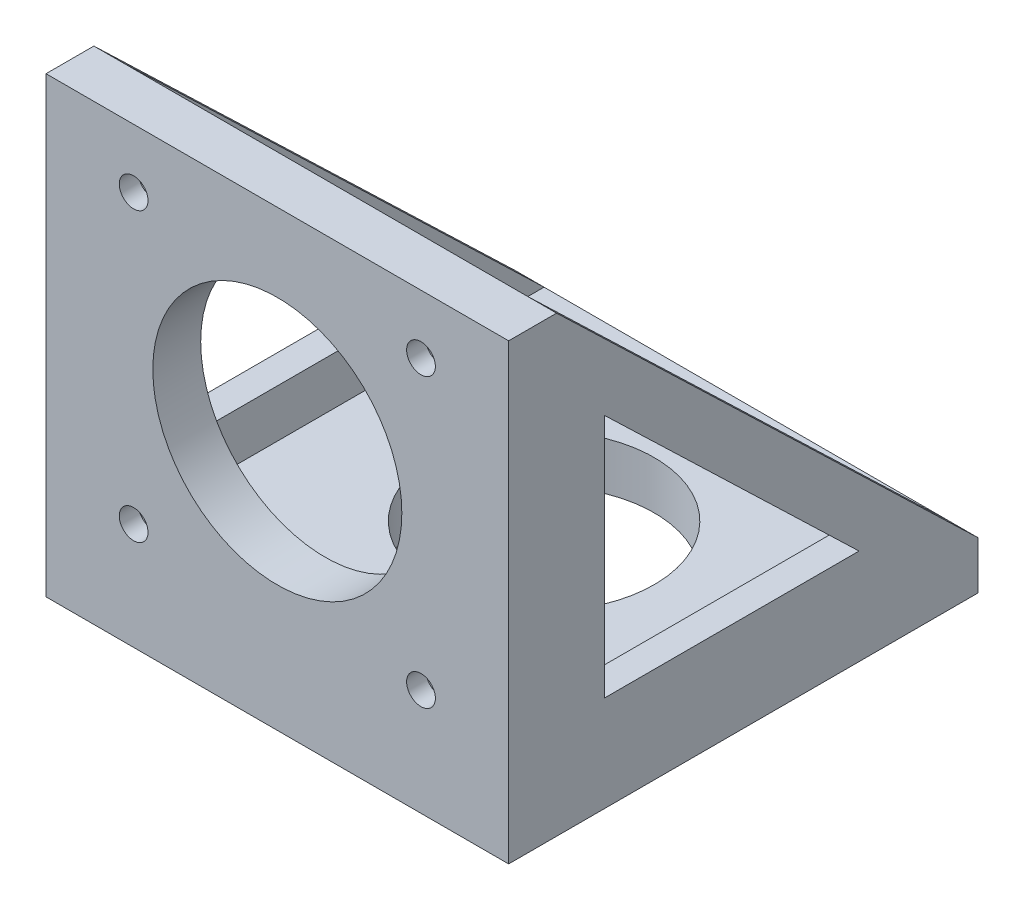
ISO-10303-21;
HEADER;
FILE_DESCRIPTION(('STEP AP214'),'2;1');
FILE_NAME('part.step','',(''),(''),'','','');
FILE_SCHEMA(('AUTOMOTIVE_DESIGN { 1 0 10303 214 1 1 1 1 }'));
ENDSEC;
DATA;
#1=APPLICATION_CONTEXT('core data for automotive mechanical design processes');
#2=APPLICATION_PROTOCOL_DEFINITION('international standard','automotive_design',2000,#1);
#3=PRODUCT_CONTEXT('',#1,'mechanical');
#4=PRODUCT('Part','Part','',(#3));
#5=PRODUCT_RELATED_PRODUCT_CATEGORY('part','',(#4));
#6=PRODUCT_DEFINITION_FORMATION('','',#4);
#7=PRODUCT_DEFINITION_CONTEXT('part definition',#1,'design');
#8=PRODUCT_DEFINITION('design','',#6,#7);
#9=PRODUCT_DEFINITION_SHAPE('','',#8);
#10=(LENGTH_UNIT() NAMED_UNIT(*) SI_UNIT(.MILLI.,.METRE.));
#11=(NAMED_UNIT(*) PLANE_ANGLE_UNIT() SI_UNIT($,.RADIAN.));
#12=(NAMED_UNIT(*) SI_UNIT($,.STERADIAN.) SOLID_ANGLE_UNIT());
#13=UNCERTAINTY_MEASURE_WITH_UNIT(LENGTH_MEASURE(1.E-05),#10,'distance_accuracy_value','');
#14=(GEOMETRIC_REPRESENTATION_CONTEXT(3) GLOBAL_UNCERTAINTY_ASSIGNED_CONTEXT((#13)) GLOBAL_UNIT_ASSIGNED_CONTEXT((#10,
#11,#12)) REPRESENTATION_CONTEXT('',''));
#15=CARTESIAN_POINT('',(0.,0.,0.));
#16=DIRECTION('',(0.,0.,1.));
#17=DIRECTION('',(1.,0.,0.));
#18=AXIS2_PLACEMENT_3D('',#15,#16,#17);
#19=CARTESIAN_POINT('',(15.,41.15,24.5));
#20=DIRECTION('',(0.,0.,-1.));
#21=DIRECTION('',(-1.,0.,0.));
#22=AXIS2_PLACEMENT_3D('',#19,#20,#21);
#23=CYLINDRICAL_SURFACE('',#22,1.5);
#24=CARTESIAN_POINT('',(15.,41.15,24.5));
#25=DIRECTION('',(0.,0.,-1.));
#26=DIRECTION('',(-1.,0.,0.));
#27=AXIS2_PLACEMENT_3D('',#24,#25,#26);
#28=CIRCLE('',#27,1.5);
#29=CARTESIAN_POINT('',(13.5,41.15,24.5));
#30=VERTEX_POINT('',#29);
#31=EDGE_CURVE('E267',#30,#30,#28,.T.);
#32=ORIENTED_EDGE('',*,*,#31,.F.);
#33=EDGE_LOOP('',(#32));
#34=FACE_BOUND('',#33,.T.);
#35=CARTESIAN_POINT('',(15.,41.15,22.5));
#36=DIRECTION('',(0.,0.,-1.));
#37=DIRECTION('',(-1.,0.,0.));
#38=AXIS2_PLACEMENT_3D('',#35,#36,#37);
#39=CIRCLE('',#38,1.5);
#40=CARTESIAN_POINT('',(13.5,41.15,22.5));
#41=VERTEX_POINT('',#40);
#42=EDGE_CURVE('E39',#41,#41,#39,.F.);
#43=ORIENTED_EDGE('',*,*,#42,.F.);
#44=EDGE_LOOP('',(#43));
#45=FACE_BOUND('',#44,.T.);
#46=ADVANCED_FACE('F35',(#34,#45),#23,.F.);
#47=CARTESIAN_POINT('',(-15.,11.15,24.5));
#48=DIRECTION('',(0.,0.,-1.));
#49=DIRECTION('',(-1.,0.,0.));
#50=AXIS2_PLACEMENT_3D('',#47,#48,#49);
#51=CYLINDRICAL_SURFACE('',#50,1.5);
#52=CARTESIAN_POINT('',(-15.,11.15,24.5));
#53=DIRECTION('',(0.,0.,-1.));
#54=DIRECTION('',(1.,0.,0.));
#55=AXIS2_PLACEMENT_3D('',#52,#53,#54);
#56=CIRCLE('',#55,1.5);
#57=CARTESIAN_POINT('',(-13.5,11.15,24.5));
#58=VERTEX_POINT('',#57);
#59=EDGE_CURVE('E255',#58,#58,#56,.T.);
#60=ORIENTED_EDGE('',*,*,#59,.F.);
#61=EDGE_LOOP('',(#60));
#62=FACE_BOUND('',#61,.T.);
#63=CARTESIAN_POINT('',(-15.,11.15,22.5));
#64=DIRECTION('',(0.,0.,-1.));
#65=DIRECTION('',(-1.,0.,0.));
#66=AXIS2_PLACEMENT_3D('',#63,#64,#65);
#67=CIRCLE('',#66,1.5);
#68=CARTESIAN_POINT('',(-16.5,11.15,22.5));
#69=VERTEX_POINT('',#68);
#70=EDGE_CURVE('E328',#69,#69,#67,.F.);
#71=ORIENTED_EDGE('',*,*,#70,.F.);
#72=EDGE_LOOP('',(#71));
#73=FACE_BOUND('',#72,.T.);
#74=ADVANCED_FACE('F338',(#62,#73),#51,.F.);
#75=CARTESIAN_POINT('',(15.,11.15,24.5));
#76=DIRECTION('',(0.,0.,-1.));
#77=DIRECTION('',(-1.,0.,0.));
#78=AXIS2_PLACEMENT_3D('',#75,#76,#77);
#79=CYLINDRICAL_SURFACE('',#78,1.5);
#80=CARTESIAN_POINT('',(15.,11.15,24.5));
#81=DIRECTION('',(0.,0.,-1.));
#82=DIRECTION('',(1.,0.,0.));
#83=AXIS2_PLACEMENT_3D('',#80,#81,#82);
#84=CIRCLE('',#83,1.5);
#85=CARTESIAN_POINT('',(16.5,11.15,24.5));
#86=VERTEX_POINT('',#85);
#87=EDGE_CURVE('E258',#86,#86,#84,.T.);
#88=ORIENTED_EDGE('',*,*,#87,.F.);
#89=EDGE_LOOP('',(#88));
#90=FACE_BOUND('',#89,.T.);
#91=CARTESIAN_POINT('',(15.,11.15,22.5));
#92=DIRECTION('',(0.,0.,-1.));
#93=DIRECTION('',(-1.,0.,0.));
#94=AXIS2_PLACEMENT_3D('',#91,#92,#93);
#95=CIRCLE('',#94,1.5);
#96=CARTESIAN_POINT('',(13.5,11.15,22.5));
#97=VERTEX_POINT('',#96);
#98=EDGE_CURVE('E326',#97,#97,#95,.F.);
#99=ORIENTED_EDGE('',*,*,#98,.F.);
#100=EDGE_LOOP('',(#99));
#101=FACE_BOUND('',#100,.T.);
#102=ADVANCED_FACE('F344',(#90,#101),#79,.F.);
#103=CARTESIAN_POINT('',(-15.,41.15,24.5));
#104=DIRECTION('',(0.,0.,-1.));
#105=DIRECTION('',(-1.,0.,0.));
#106=AXIS2_PLACEMENT_3D('',#103,#104,#105);
#107=CYLINDRICAL_SURFACE('',#106,1.5);
#108=CARTESIAN_POINT('',(-15.,41.15,24.5));
#109=DIRECTION('',(0.,0.,-1.));
#110=DIRECTION('',(-1.,0.,0.));
#111=AXIS2_PLACEMENT_3D('',#108,#109,#110);
#112=CIRCLE('',#111,1.5);
#113=CARTESIAN_POINT('',(-16.5,41.15,24.5));
#114=VERTEX_POINT('',#113);
#115=EDGE_CURVE('E264',#114,#114,#112,.T.);
#116=ORIENTED_EDGE('',*,*,#115,.F.);
#117=EDGE_LOOP('',(#116));
#118=FACE_BOUND('',#117,.T.);
#119=CARTESIAN_POINT('',(-15.,41.15,22.5));
#120=DIRECTION('',(0.,0.,-1.));
#121=DIRECTION('',(-1.,0.,0.));
#122=AXIS2_PLACEMENT_3D('',#119,#120,#121);
#123=CIRCLE('',#122,1.5);
#124=CARTESIAN_POINT('',(-16.5,41.15,22.5));
#125=VERTEX_POINT('',#124);
#126=EDGE_CURVE('E207',#125,#125,#123,.F.);
#127=ORIENTED_EDGE('',*,*,#126,.F.);
#128=EDGE_LOOP('',(#127));
#129=FACE_BOUND('',#128,.T.);
#130=ADVANCED_FACE('F385',(#118,#129),#107,.F.);
#131=CARTESIAN_POINT('',(0.,5.,0.));
#132=DIRECTION('',(0.,1.,0.));
#133=DIRECTION('',(0.,0.,1.));
#134=AXIS2_PLACEMENT_3D('',#131,#132,#133);
#135=PLANE('',#134);
#136=DIRECTION('',(-1.,0.,0.));
#137=VECTOR('',#136,1.);
#138=CARTESIAN_POINT('',(-21.15,5.,19.5));
#139=LINE('',#138,#137);
#140=CARTESIAN_POINT('',(21.15,5.,19.5));
#141=VERTEX_POINT('',#140);
#142=CARTESIAN_POINT('',(-21.15,5.,19.5));
#143=VERTEX_POINT('',#142);
#144=EDGE_CURVE('E272',#141,#143,#139,.T.);
#145=ORIENTED_EDGE('',*,*,#144,.F.);
#146=DIRECTION('',(0.,0.,-1.));
#147=VECTOR('',#146,1.);
#148=CARTESIAN_POINT('',(21.15,5.,-24.5));
#149=LINE('',#148,#147);
#150=CARTESIAN_POINT('',(21.15,5.,-24.5));
#151=VERTEX_POINT('',#150);
#152=EDGE_CURVE('E316',#141,#151,#149,.T.);
#153=ORIENTED_EDGE('',*,*,#152,.T.);
#154=DIRECTION('',(-1.,0.,0.));
#155=VECTOR('',#154,1.);
#156=CARTESIAN_POINT('',(-21.15,5.,-24.5));
#157=LINE('',#156,#155);
#158=CARTESIAN_POINT('',(-21.15,5.,-24.5));
#159=VERTEX_POINT('',#158);
#160=EDGE_CURVE('E44',#151,#159,#157,.T.);
#161=ORIENTED_EDGE('',*,*,#160,.T.);
#162=DIRECTION('',(0.,0.,1.));
#163=VECTOR('',#162,1.);
#164=CARTESIAN_POINT('',(-21.15,5.,-24.5));
#165=LINE('',#164,#163);
#166=EDGE_CURVE('E11',#159,#143,#165,.T.);
#167=ORIENTED_EDGE('',*,*,#166,.T.);
#168=EDGE_LOOP('',(#145,#153,#161,#167));
#169=FACE_BOUND('',#168,.T.);
#170=CARTESIAN_POINT('',(15.5,5.,12.15));
#171=DIRECTION('',(0.,1.,0.));
#172=DIRECTION('',(0.,0.,-1.));
#173=AXIS2_PLACEMENT_3D('',#170,#171,#172);
#174=CIRCLE('',#173,1.49999999999999);
#175=CARTESIAN_POINT('',(15.5,5.,10.65));
#176=VERTEX_POINT('',#175);
#177=EDGE_CURVE('E292',#176,#176,#174,.T.);
#178=ORIENTED_EDGE('',*,*,#177,.F.);
#179=EDGE_LOOP('',(#178));
#180=FACE_BOUND('',#179,.T.);
#181=CARTESIAN_POINT('',(15.5,5.,-18.85));
#182=DIRECTION('',(0.,1.,0.));
#183=DIRECTION('',(0.,0.,1.));
#184=AXIS2_PLACEMENT_3D('',#181,#182,#183);
#185=CIRCLE('',#184,1.5);
#186=CARTESIAN_POINT('',(15.5,5.,-17.35));
#187=VERTEX_POINT('',#186);
#188=EDGE_CURVE('E304',#187,#187,#185,.T.);
#189=ORIENTED_EDGE('',*,*,#188,.F.);
#190=EDGE_LOOP('',(#189));
#191=FACE_BOUND('',#190,.T.);
#192=CARTESIAN_POINT('',(-15.5,5.,-18.85));
#193=DIRECTION('',(0.,1.,0.));
#194=DIRECTION('',(0.,0.,1.));
#195=AXIS2_PLACEMENT_3D('',#192,#193,#194);
#196=CIRCLE('',#195,1.5);
#197=CARTESIAN_POINT('',(-15.5,5.,-17.35));
#198=VERTEX_POINT('',#197);
#199=EDGE_CURVE('E310',#198,#198,#196,.T.);
#200=ORIENTED_EDGE('',*,*,#199,.F.);
#201=EDGE_LOOP('',(#200));
#202=FACE_BOUND('',#201,.T.);
#203=CARTESIAN_POINT('',(-15.5,5.,12.15));
#204=DIRECTION('',(0.,1.,0.));
#205=DIRECTION('',(0.,0.,-1.));
#206=AXIS2_PLACEMENT_3D('',#203,#204,#205);
#207=CIRCLE('',#206,1.5);
#208=CARTESIAN_POINT('',(-15.5,5.,10.65));
#209=VERTEX_POINT('',#208);
#210=EDGE_CURVE('E298',#209,#209,#207,.T.);
#211=ORIENTED_EDGE('',*,*,#210,.F.);
#212=EDGE_LOOP('',(#211));
#213=FACE_BOUND('',#212,.T.);
#214=CARTESIAN_POINT('',(0.,5.,-3.35));
#215=DIRECTION('',(0.,1.,0.));
#216=DIRECTION('',(0.,0.,1.));
#217=AXIS2_PLACEMENT_3D('',#214,#215,#216);
#218=CIRCLE('',#217,11.5);
#219=CARTESIAN_POINT('',(0.,5.,8.15));
#220=VERTEX_POINT('',#219);
#221=EDGE_CURVE('E286',#220,#220,#218,.T.);
#222=ORIENTED_EDGE('',*,*,#221,.F.);
#223=EDGE_LOOP('',(#222));
#224=FACE_BOUND('',#223,.T.);
#225=ADVANCED_FACE('F381',(#169,#180,#191,#202,#213,#224),#135,.T.);
#226=CARTESIAN_POINT('',(0.,0.,0.));
#227=DIRECTION('',(0.,1.,0.));
#228=DIRECTION('',(0.,0.,1.));
#229=AXIS2_PLACEMENT_3D('',#226,#227,#228);
#230=PLANE('',#229);
#231=DIRECTION('',(-1.,0.,0.));
#232=VECTOR('',#231,1.);
#233=CARTESIAN_POINT('',(-21.15,0.,-24.5));
#234=LINE('',#233,#232);
#235=CARTESIAN_POINT('',(24.15,0.,-24.5));
#236=VERTEX_POINT('',#235);
#237=CARTESIAN_POINT('',(-24.15,0.,-24.5));
#238=VERTEX_POINT('',#237);
#239=EDGE_CURVE('E313',#236,#238,#234,.T.);
#240=ORIENTED_EDGE('',*,*,#239,.F.);
#241=DIRECTION('',(0.,0.,-1.));
#242=VECTOR('',#241,1.);
#243=CARTESIAN_POINT('',(24.15,0.,-24.5));
#244=LINE('',#243,#242);
#245=CARTESIAN_POINT('',(24.15,0.,24.5));
#246=VERTEX_POINT('',#245);
#247=EDGE_CURVE('E240',#246,#236,#244,.T.);
#248=ORIENTED_EDGE('',*,*,#247,.F.);
#249=DIRECTION('',(1.,0.,0.));
#250=VECTOR('',#249,1.);
#251=CARTESIAN_POINT('',(-21.15,0.,24.5));
#252=LINE('',#251,#250);
#253=CARTESIAN_POINT('',(-24.15,0.,24.5));
#254=VERTEX_POINT('',#253);
#255=EDGE_CURVE('E319',#254,#246,#252,.T.);
#256=ORIENTED_EDGE('',*,*,#255,.F.);
#257=DIRECTION('',(0.,0.,1.));
#258=VECTOR('',#257,1.);
#259=CARTESIAN_POINT('',(-24.15,0.,-24.5));
#260=LINE('',#259,#258);
#261=EDGE_CURVE('E219',#238,#254,#260,.T.);
#262=ORIENTED_EDGE('',*,*,#261,.F.);
#263=EDGE_LOOP('',(#240,#248,#256,#262));
#264=FACE_BOUND('',#263,.T.);
#265=CARTESIAN_POINT('',(-15.5,0.,-18.85));
#266=DIRECTION('',(0.,1.,0.));
#267=DIRECTION('',(0.,0.,1.));
#268=AXIS2_PLACEMENT_3D('',#265,#266,#267);
#269=CIRCLE('',#268,1.5);
#270=CARTESIAN_POINT('',(-15.5,0.,-17.35));
#271=VERTEX_POINT('',#270);
#272=EDGE_CURVE('E307',#271,#271,#269,.T.);
#273=ORIENTED_EDGE('',*,*,#272,.T.);
#274=EDGE_LOOP('',(#273));
#275=FACE_BOUND('',#274,.T.);
#276=CARTESIAN_POINT('',(15.5,0.,-18.85));
#277=DIRECTION('',(0.,1.,0.));
#278=DIRECTION('',(0.,0.,1.));
#279=AXIS2_PLACEMENT_3D('',#276,#277,#278);
#280=CIRCLE('',#279,1.5);
#281=CARTESIAN_POINT('',(15.5,0.,-17.35));
#282=VERTEX_POINT('',#281);
#283=EDGE_CURVE('E301',#282,#282,#280,.T.);
#284=ORIENTED_EDGE('',*,*,#283,.T.);
#285=EDGE_LOOP('',(#284));
#286=FACE_BOUND('',#285,.T.);
#287=CARTESIAN_POINT('',(-15.5,0.,12.15));
#288=DIRECTION('',(0.,1.,0.));
#289=DIRECTION('',(0.,0.,-1.));
#290=AXIS2_PLACEMENT_3D('',#287,#288,#289);
#291=CIRCLE('',#290,1.5);
#292=CARTESIAN_POINT('',(-15.5,0.,10.65));
#293=VERTEX_POINT('',#292);
#294=EDGE_CURVE('E295',#293,#293,#291,.T.);
#295=ORIENTED_EDGE('',*,*,#294,.T.);
#296=EDGE_LOOP('',(#295));
#297=FACE_BOUND('',#296,.T.);
#298=CARTESIAN_POINT('',(15.5,0.,12.15));
#299=DIRECTION('',(0.,1.,0.));
#300=DIRECTION('',(0.,0.,-1.));
#301=AXIS2_PLACEMENT_3D('',#298,#299,#300);
#302=CIRCLE('',#301,1.49999999999999);
#303=CARTESIAN_POINT('',(15.5,0.,10.65));
#304=VERTEX_POINT('',#303);
#305=EDGE_CURVE('E289',#304,#304,#302,.T.);
#306=ORIENTED_EDGE('',*,*,#305,.T.);
#307=EDGE_LOOP('',(#306));
#308=FACE_BOUND('',#307,.T.);
#309=CARTESIAN_POINT('',(0.,0.,-3.35));
#310=DIRECTION('',(0.,1.,0.));
#311=DIRECTION('',(0.,0.,1.));
#312=AXIS2_PLACEMENT_3D('',#309,#310,#311);
#313=CIRCLE('',#312,11.5);
#314=CARTESIAN_POINT('',(0.,0.,8.15));
#315=VERTEX_POINT('',#314);
#316=EDGE_CURVE('E285',#315,#315,#313,.T.);
#317=ORIENTED_EDGE('',*,*,#316,.T.);
#318=EDGE_LOOP('',(#317));
#319=FACE_BOUND('',#318,.T.);
#320=ADVANCED_FACE('F384',(#264,#275,#286,#297,#308,#319),#230,.F.);
#321=CARTESIAN_POINT('',(-21.15,5.,-24.5));
#322=DIRECTION('',(0.,0.,1.));
#323=DIRECTION('',(1.,0.,0.));
#324=AXIS2_PLACEMENT_3D('',#321,#322,#323);
#325=PLANE('',#324);
#326=ORIENTED_EDGE('',*,*,#239,.T.);
#327=DIRECTION('',(0.,-1.,0.));
#328=VECTOR('',#327,1.);
#329=CARTESIAN_POINT('',(-24.15,5.,-24.5));
#330=LINE('',#329,#328);
#331=CARTESIAN_POINT('',(-24.15,5.,-24.5));
#332=VERTEX_POINT('',#331);
#333=EDGE_CURVE('E216',#332,#238,#330,.T.);
#334=ORIENTED_EDGE('',*,*,#333,.F.);
#335=DIRECTION('',(1.,0.,0.));
#336=VECTOR('',#335,1.);
#337=CARTESIAN_POINT('',(-24.15,5.,-24.5));
#338=LINE('',#337,#336);
#339=EDGE_CURVE('E225',#332,#159,#338,.T.);
#340=ORIENTED_EDGE('',*,*,#339,.T.);
#341=ORIENTED_EDGE('',*,*,#160,.F.);
#342=DIRECTION('',(-1.,0.,0.));
#343=VECTOR('',#342,1.);
#344=CARTESIAN_POINT('',(24.15,5.,-24.5));
#345=LINE('',#344,#343);
#346=CARTESIAN_POINT('',(24.15,5.,-24.5));
#347=VERTEX_POINT('',#346);
#348=EDGE_CURVE('E252',#347,#151,#345,.T.);
#349=ORIENTED_EDGE('',*,*,#348,.F.);
#350=DIRECTION('',(0.,1.,0.));
#351=VECTOR('',#350,1.);
#352=CARTESIAN_POINT('',(24.15,5.,-24.5));
#353=LINE('',#352,#351);
#354=EDGE_CURVE('E243',#236,#347,#353,.T.);
#355=ORIENTED_EDGE('',*,*,#354,.F.);
#356=EDGE_LOOP('',(#326,#334,#340,#341,#349,#355));
#357=FACE_BOUND('',#356,.T.);
#358=ADVANCED_FACE('F37',(#357),#325,.F.);
#359=CARTESIAN_POINT('',(-21.15,5.,24.5));
#360=DIRECTION('',(0.,0.,-1.));
#361=DIRECTION('',(-1.,0.,0.));
#362=AXIS2_PLACEMENT_3D('',#359,#360,#361);
#363=PLANE('',#362);
#364=ORIENTED_EDGE('',*,*,#115,.T.);
#365=EDGE_LOOP('',(#364));
#366=FACE_BOUND('',#365,.T.);
#367=ORIENTED_EDGE('',*,*,#87,.T.);
#368=EDGE_LOOP('',(#367));
#369=FACE_BOUND('',#368,.T.);
#370=ORIENTED_EDGE('',*,*,#59,.T.);
#371=EDGE_LOOP('',(#370));
#372=FACE_BOUND('',#371,.T.);
#373=CARTESIAN_POINT('',(0.,26.15,24.5));
#374=DIRECTION('',(0.,0.,-1.));
#375=DIRECTION('',(-1.,0.,0.));
#376=AXIS2_PLACEMENT_3D('',#373,#374,#375);
#377=CIRCLE('',#376,13.);
#378=CARTESIAN_POINT('',(-13.,26.15,24.5));
#379=VERTEX_POINT('',#378);
#380=EDGE_CURVE('E259',#379,#379,#377,.T.);
#381=ORIENTED_EDGE('',*,*,#380,.T.);
#382=EDGE_LOOP('',(#381));
#383=FACE_BOUND('',#382,.T.);
#384=ORIENTED_EDGE('',*,*,#31,.T.);
#385=EDGE_LOOP('',(#384));
#386=FACE_BOUND('',#385,.T.);
#387=ORIENTED_EDGE('',*,*,#255,.T.);
#388=DIRECTION('',(0.,-1.,0.));
#389=VECTOR('',#388,1.);
#390=CARTESIAN_POINT('',(24.15,0.,24.5));
#391=LINE('',#390,#389);
#392=CARTESIAN_POINT('',(24.15,47.3,24.5));
#393=VERTEX_POINT('',#392);
#394=EDGE_CURVE('E237',#393,#246,#391,.T.);
#395=ORIENTED_EDGE('',*,*,#394,.F.);
#396=DIRECTION('',(1.,0.,0.));
#397=VECTOR('',#396,1.);
#398=CARTESIAN_POINT('',(-21.15,47.3,24.5));
#399=LINE('',#398,#397);
#400=CARTESIAN_POINT('',(-24.15,47.3,24.5));
#401=VERTEX_POINT('',#400);
#402=EDGE_CURVE('E273',#401,#393,#399,.T.);
#403=ORIENTED_EDGE('',*,*,#402,.F.);
#404=DIRECTION('',(0.,1.,0.));
#405=VECTOR('',#404,1.);
#406=CARTESIAN_POINT('',(-24.15,0.,24.5));
#407=LINE('',#406,#405);
#408=EDGE_CURVE('E222',#254,#401,#407,.T.);
#409=ORIENTED_EDGE('',*,*,#408,.F.);
#410=EDGE_LOOP('',(#387,#395,#403,#409));
#411=FACE_BOUND('',#410,.T.);
#412=ADVANCED_FACE('F379',(#366,#369,#372,#383,#386,#411),#363,.F.);
#413=CARTESIAN_POINT('',(-15.5,5.,-18.85));
#414=DIRECTION('',(0.,-1.,0.));
#415=DIRECTION('',(0.,0.,-1.));
#416=AXIS2_PLACEMENT_3D('',#413,#414,#415);
#417=CYLINDRICAL_SURFACE('',#416,1.5);
#418=ORIENTED_EDGE('',*,*,#199,.T.);
#419=EDGE_LOOP('',(#418));
#420=FACE_BOUND('',#419,.T.);
#421=ORIENTED_EDGE('',*,*,#272,.F.);
#422=EDGE_LOOP('',(#421));
#423=FACE_BOUND('',#422,.T.);
#424=ADVANCED_FACE('F375',(#420,#423),#417,.F.);
#425=CARTESIAN_POINT('',(15.5,5.,-18.85));
#426=DIRECTION('',(0.,-1.,0.));
#427=DIRECTION('',(0.,0.,-1.));
#428=AXIS2_PLACEMENT_3D('',#425,#426,#427);
#429=CYLINDRICAL_SURFACE('',#428,1.5);
#430=ORIENTED_EDGE('',*,*,#188,.T.);
#431=EDGE_LOOP('',(#430));
#432=FACE_BOUND('',#431,.T.);
#433=ORIENTED_EDGE('',*,*,#283,.F.);
#434=EDGE_LOOP('',(#433));
#435=FACE_BOUND('',#434,.T.);
#436=ADVANCED_FACE('F371',(#432,#435),#429,.F.);
#437=CARTESIAN_POINT('',(-15.5,5.,12.15));
#438=DIRECTION('',(0.,-1.,0.));
#439=DIRECTION('',(0.,0.,-1.));
#440=AXIS2_PLACEMENT_3D('',#437,#438,#439);
#441=CYLINDRICAL_SURFACE('',#440,1.5);
#442=ORIENTED_EDGE('',*,*,#210,.T.);
#443=EDGE_LOOP('',(#442));
#444=FACE_BOUND('',#443,.T.);
#445=ORIENTED_EDGE('',*,*,#294,.F.);
#446=EDGE_LOOP('',(#445));
#447=FACE_BOUND('',#446,.T.);
#448=ADVANCED_FACE('F367',(#444,#447),#441,.F.);
#449=CARTESIAN_POINT('',(15.5,5.,12.15));
#450=DIRECTION('',(0.,-1.,0.));
#451=DIRECTION('',(0.,0.,-1.));
#452=AXIS2_PLACEMENT_3D('',#449,#450,#451);
#453=CYLINDRICAL_SURFACE('',#452,1.49999999999999);
#454=ORIENTED_EDGE('',*,*,#177,.T.);
#455=EDGE_LOOP('',(#454));
#456=FACE_BOUND('',#455,.T.);
#457=ORIENTED_EDGE('',*,*,#305,.F.);
#458=EDGE_LOOP('',(#457));
#459=FACE_BOUND('',#458,.T.);
#460=ADVANCED_FACE('F363',(#456,#459),#453,.F.);
#461=CARTESIAN_POINT('',(0.,5.,-3.35));
#462=DIRECTION('',(0.,-1.,0.));
#463=DIRECTION('',(0.,0.,-1.));
#464=AXIS2_PLACEMENT_3D('',#461,#462,#463);
#465=CYLINDRICAL_SURFACE('',#464,11.5);
#466=ORIENTED_EDGE('',*,*,#221,.T.);
#467=EDGE_LOOP('',(#466));
#468=FACE_BOUND('',#467,.T.);
#469=ORIENTED_EDGE('',*,*,#316,.F.);
#470=EDGE_LOOP('',(#469));
#471=FACE_BOUND('',#470,.T.);
#472=ADVANCED_FACE('F359',(#468,#471),#465,.F.);
#473=CARTESIAN_POINT('',(-21.15,47.3,19.5));
#474=DIRECTION('',(0.,0.,1.));
#475=DIRECTION('',(1.,0.,0.));
#476=AXIS2_PLACEMENT_3D('',#473,#474,#475);
#477=PLANE('',#476);
#478=CARTESIAN_POINT('',(15.,11.15,19.5));
#479=DIRECTION('',(0.,0.,-1.));
#480=DIRECTION('',(-1.,0.,0.));
#481=AXIS2_PLACEMENT_3D('',#478,#479,#480);
#482=CIRCLE('',#481,3.);
#483=CARTESIAN_POINT('',(12.,11.15,19.5));
#484=VERTEX_POINT('',#483);
#485=EDGE_CURVE('E185',#484,#484,#482,.T.);
#486=ORIENTED_EDGE('',*,*,#485,.F.);
#487=EDGE_LOOP('',(#486));
#488=FACE_BOUND('',#487,.T.);
#489=CARTESIAN_POINT('',(-15.,11.15,19.5));
#490=DIRECTION('',(0.,0.,-1.));
#491=DIRECTION('',(-1.,0.,0.));
#492=AXIS2_PLACEMENT_3D('',#489,#490,#491);
#493=CIRCLE('',#492,3.);
#494=CARTESIAN_POINT('',(-18.,11.15,19.5));
#495=VERTEX_POINT('',#494);
#496=EDGE_CURVE('E196',#495,#495,#493,.T.);
#497=ORIENTED_EDGE('',*,*,#496,.F.);
#498=EDGE_LOOP('',(#497));
#499=FACE_BOUND('',#498,.T.);
#500=CARTESIAN_POINT('',(-15.,41.15,19.5));
#501=DIRECTION('',(0.,0.,-1.));
#502=DIRECTION('',(-1.,0.,0.));
#503=AXIS2_PLACEMENT_3D('',#500,#501,#502);
#504=CIRCLE('',#503,3.);
#505=CARTESIAN_POINT('',(-18.,41.15,19.5));
#506=VERTEX_POINT('',#505);
#507=EDGE_CURVE('E190',#506,#506,#504,.T.);
#508=ORIENTED_EDGE('',*,*,#507,.F.);
#509=EDGE_LOOP('',(#508));
#510=FACE_BOUND('',#509,.T.);
#511=CARTESIAN_POINT('',(15.,41.15,19.5));
#512=DIRECTION('',(0.,0.,-1.));
#513=DIRECTION('',(-1.,0.,0.));
#514=AXIS2_PLACEMENT_3D('',#511,#512,#513);
#515=CIRCLE('',#514,3.);
#516=CARTESIAN_POINT('',(12.,41.15,19.5));
#517=VERTEX_POINT('',#516);
#518=EDGE_CURVE('E189',#517,#517,#515,.T.);
#519=ORIENTED_EDGE('',*,*,#518,.F.);
#520=EDGE_LOOP('',(#519));
#521=FACE_BOUND('',#520,.T.);
#522=CARTESIAN_POINT('',(0.,26.15,19.5));
#523=DIRECTION('',(0.,0.,-1.));
#524=DIRECTION('',(-1.,0.,0.));
#525=AXIS2_PLACEMENT_3D('',#522,#523,#524);
#526=CIRCLE('',#525,13.);
#527=CARTESIAN_POINT('',(-13.,26.15,19.5));
#528=VERTEX_POINT('',#527);
#529=EDGE_CURVE('E254',#528,#528,#526,.T.);
#530=ORIENTED_EDGE('',*,*,#529,.F.);
#531=EDGE_LOOP('',(#530));
#532=FACE_BOUND('',#531,.T.);
#533=ORIENTED_EDGE('',*,*,#144,.T.);
#534=DIRECTION('',(0.,-1.,0.));
#535=VECTOR('',#534,1.);
#536=CARTESIAN_POINT('',(-21.15,47.3,19.5));
#537=LINE('',#536,#535);
#538=CARTESIAN_POINT('',(-21.15,47.3,19.5));
#539=VERTEX_POINT('',#538);
#540=EDGE_CURVE('E278',#539,#143,#537,.T.);
#541=ORIENTED_EDGE('',*,*,#540,.F.);
#542=DIRECTION('',(-1.,0.,0.));
#543=VECTOR('',#542,1.);
#544=CARTESIAN_POINT('',(-21.15,47.3,19.5));
#545=LINE('',#544,#543);
#546=CARTESIAN_POINT('',(21.15,47.3,19.5));
#547=VERTEX_POINT('',#546);
#548=EDGE_CURVE('E275',#547,#539,#545,.T.);
#549=ORIENTED_EDGE('',*,*,#548,.F.);
#550=DIRECTION('',(0.,-1.,0.));
#551=VECTOR('',#550,1.);
#552=CARTESIAN_POINT('',(21.15,47.3,19.5));
#553=LINE('',#552,#551);
#554=EDGE_CURVE('E282',#547,#141,#553,.T.);
#555=ORIENTED_EDGE('',*,*,#554,.T.);
#556=EDGE_LOOP('',(#533,#541,#549,#555));
#557=FACE_BOUND('',#556,.T.);
#558=ADVANCED_FACE('F355',(#488,#499,#510,#521,#532,#557),#477,.F.);
#559=CARTESIAN_POINT('',(0.,47.3,0.));
#560=DIRECTION('',(0.,-1.,0.));
#561=DIRECTION('',(0.,0.,-1.));
#562=AXIS2_PLACEMENT_3D('',#559,#560,#561);
#563=PLANE('',#562);
#564=ORIENTED_EDGE('',*,*,#548,.T.);
#565=DIRECTION('',(1.,0.,0.));
#566=VECTOR('',#565,1.);
#567=CARTESIAN_POINT('',(-24.15,47.3,19.5));
#568=LINE('',#567,#566);
#569=CARTESIAN_POINT('',(-24.15,47.3,19.5));
#570=VERTEX_POINT('',#569);
#571=EDGE_CURVE('E230',#570,#539,#568,.T.);
#572=ORIENTED_EDGE('',*,*,#571,.F.);
#573=DIRECTION('',(0.,0.,-1.));
#574=VECTOR('',#573,1.);
#575=CARTESIAN_POINT('',(-24.15,47.3,24.5));
#576=LINE('',#575,#574);
#577=EDGE_CURVE('E210',#401,#570,#576,.T.);
#578=ORIENTED_EDGE('',*,*,#577,.F.);
#579=ORIENTED_EDGE('',*,*,#402,.T.);
#580=DIRECTION('',(0.,0.,1.));
#581=VECTOR('',#580,1.);
#582=CARTESIAN_POINT('',(24.15,47.3,24.5));
#583=LINE('',#582,#581);
#584=CARTESIAN_POINT('',(24.15,47.3,19.5));
#585=VERTEX_POINT('',#584);
#586=EDGE_CURVE('E234',#585,#393,#583,.T.);
#587=ORIENTED_EDGE('',*,*,#586,.F.);
#588=DIRECTION('',(-1.,0.,0.));
#589=VECTOR('',#588,1.);
#590=CARTESIAN_POINT('',(24.15,47.3,19.5));
#591=LINE('',#590,#589);
#592=EDGE_CURVE('E247',#585,#547,#591,.T.);
#593=ORIENTED_EDGE('',*,*,#592,.T.);
#594=EDGE_LOOP('',(#564,#572,#578,#579,#587,#593));
#595=FACE_BOUND('',#594,.T.);
#596=ADVANCED_FACE('F351',(#595),#563,.F.);
#597=CARTESIAN_POINT('',(0.,26.15,24.5));
#598=DIRECTION('',(0.,0.,-1.));
#599=DIRECTION('',(-1.,0.,0.));
#600=AXIS2_PLACEMENT_3D('',#597,#598,#599);
#601=CYLINDRICAL_SURFACE('',#600,13.);
#602=ORIENTED_EDGE('',*,*,#380,.F.);
#603=EDGE_LOOP('',(#602));
#604=FACE_BOUND('',#603,.T.);
#605=ORIENTED_EDGE('',*,*,#529,.T.);
#606=EDGE_LOOP('',(#605));
#607=FACE_BOUND('',#606,.T.);
#608=ADVANCED_FACE('F354',(#604,#607),#601,.F.);
#609=CARTESIAN_POINT('',(21.15,0.,0.));
#610=DIRECTION('',(-1.,0.,0.));
#611=DIRECTION('',(0.,0.,1.));
#612=AXIS2_PLACEMENT_3D('',#609,#610,#611);
#613=PLANE('',#612);
#614=DIRECTION('',(0.,0.,1.));
#615=VECTOR('',#614,1.);
#616=CARTESIAN_POINT('',(21.15,10.,0.));
#617=LINE('',#616,#615);
#618=CARTESIAN_POINT('',(21.15,10.,-12.0844971861702));
#619=VERTEX_POINT('',#618);
#620=CARTESIAN_POINT('',(21.15,10.,14.5));
#621=VERTEX_POINT('',#620);
#622=EDGE_CURVE('E143',#619,#621,#617,.T.);
#623=ORIENTED_EDGE('',*,*,#622,.F.);
#624=DIRECTION('',(0.,-0.693043227762536,-0.720896028878288));
#625=VECTOR('',#624,1.);
#626=CARTESIAN_POINT('',(21.15,11.2344719908786,-10.8004128457764));
#627=LINE('',#626,#625);
#628=CARTESIAN_POINT('',(21.15,35.5573688857955,14.5));
#629=VERTEX_POINT('',#628);
#630=EDGE_CURVE('E179',#629,#619,#627,.T.);
#631=ORIENTED_EDGE('',*,*,#630,.F.);
#632=DIRECTION('',(0.,1.,0.));
#633=VECTOR('',#632,1.);
#634=CARTESIAN_POINT('',(21.15,0.,14.5));
#635=LINE('',#634,#633);
#636=EDGE_CURVE('E174',#621,#629,#635,.T.);
#637=ORIENTED_EDGE('',*,*,#636,.F.);
#638=EDGE_LOOP('',(#623,#631,#637));
#639=FACE_BOUND('',#638,.T.);
#640=ORIENTED_EDGE('',*,*,#152,.F.);
#641=ORIENTED_EDGE('',*,*,#554,.F.);
#642=DIRECTION('',(0.,0.693043227762536,0.720896028878288));
#643=VECTOR('',#642,1.);
#644=CARTESIAN_POINT('',(21.15,47.3,19.5));
#645=LINE('',#644,#643);
#646=EDGE_CURVE('E233',#151,#547,#645,.T.);
#647=ORIENTED_EDGE('',*,*,#646,.F.);
#648=EDGE_LOOP('',(#640,#641,#647));
#649=FACE_BOUND('',#648,.T.);
#650=ADVANCED_FACE('F425',(#639,#649),#613,.T.);
#651=CARTESIAN_POINT('',(24.15,47.3,19.5));
#652=DIRECTION('',(0.,-0.720896028878288,0.693043227762536));
#653=DIRECTION('',(0.,-0.693043227762536,-0.720896028878288));
#654=AXIS2_PLACEMENT_3D('',#651,#652,#653);
#655=PLANE('',#654);
#656=ORIENTED_EDGE('',*,*,#646,.T.);
#657=ORIENTED_EDGE('',*,*,#592,.F.);
#658=DIRECTION('',(0.,0.693043227762536,0.720896028878288));
#659=VECTOR('',#658,1.);
#660=CARTESIAN_POINT('',(24.15,47.3,19.5));
#661=LINE('',#660,#659);
#662=EDGE_CURVE('E245',#347,#585,#661,.T.);
#663=ORIENTED_EDGE('',*,*,#662,.F.);
#664=ORIENTED_EDGE('',*,*,#348,.T.);
#665=EDGE_LOOP('',(#656,#657,#663,#664));
#666=FACE_BOUND('',#665,.T.);
#667=ADVANCED_FACE('F428',(#666),#655,.F.);
#668=CARTESIAN_POINT('',(24.15,0.,0.));
#669=DIRECTION('',(-1.,0.,0.));
#670=DIRECTION('',(0.,0.,1.));
#671=AXIS2_PLACEMENT_3D('',#668,#669,#670);
#672=PLANE('',#671);
#673=DIRECTION('',(0.,-0.693043227762536,-0.720896028878288));
#674=VECTOR('',#673,1.);
#675=CARTESIAN_POINT('',(24.15,10.,-12.0844971861702));
#676=LINE('',#675,#674);
#677=CARTESIAN_POINT('',(24.15,35.5573688857955,14.5));
#678=VERTEX_POINT('',#677);
#679=CARTESIAN_POINT('',(24.15,10.,-12.0844971861702));
#680=VERTEX_POINT('',#679);
#681=EDGE_CURVE('E60',#678,#680,#676,.T.);
#682=ORIENTED_EDGE('',*,*,#681,.T.);
#683=DIRECTION('',(0.,0.,1.));
#684=VECTOR('',#683,1.);
#685=CARTESIAN_POINT('',(24.15,10.,14.5));
#686=LINE('',#685,#684);
#687=CARTESIAN_POINT('',(24.15,10.,14.5));
#688=VERTEX_POINT('',#687);
#689=EDGE_CURVE('E141',#680,#688,#686,.T.);
#690=ORIENTED_EDGE('',*,*,#689,.T.);
#691=DIRECTION('',(0.,1.,0.));
#692=VECTOR('',#691,1.);
#693=CARTESIAN_POINT('',(24.15,35.5573688857955,14.5));
#694=LINE('',#693,#692);
#695=EDGE_CURVE('E149',#688,#678,#694,.T.);
#696=ORIENTED_EDGE('',*,*,#695,.T.);
#697=EDGE_LOOP('',(#682,#690,#696));
#698=FACE_BOUND('',#697,.T.);
#699=ORIENTED_EDGE('',*,*,#586,.T.);
#700=ORIENTED_EDGE('',*,*,#394,.T.);
#701=ORIENTED_EDGE('',*,*,#247,.T.);
#702=ORIENTED_EDGE('',*,*,#354,.T.);
#703=ORIENTED_EDGE('',*,*,#662,.T.);
#704=EDGE_LOOP('',(#699,#700,#701,#702,#703));
#705=FACE_BOUND('',#704,.T.);
#706=ADVANCED_FACE('F154',(#698,#705),#672,.F.);
#707=CARTESIAN_POINT('',(-21.15,0.,0.));
#708=DIRECTION('',(-1.,0.,0.));
#709=DIRECTION('',(0.,0.,1.));
#710=AXIS2_PLACEMENT_3D('',#707,#708,#709);
#711=PLANE('',#710);
#712=DIRECTION('',(0.,-0.693043227762536,-0.720896028878288));
#713=VECTOR('',#712,1.);
#714=CARTESIAN_POINT('',(-21.15,11.2344719908786,-10.8004128457764));
#715=LINE('',#714,#713);
#716=CARTESIAN_POINT('',(-21.15,35.5573688857955,14.5));
#717=VERTEX_POINT('',#716);
#718=CARTESIAN_POINT('',(-21.15,10.,-12.0844971861702));
#719=VERTEX_POINT('',#718);
#720=EDGE_CURVE('E176',#717,#719,#715,.T.);
#721=ORIENTED_EDGE('',*,*,#720,.T.);
#722=DIRECTION('',(0.,0.,1.));
#723=VECTOR('',#722,1.);
#724=CARTESIAN_POINT('',(-21.15,10.,0.));
#725=LINE('',#724,#723);
#726=CARTESIAN_POINT('',(-21.15,10.,14.5));
#727=VERTEX_POINT('',#726);
#728=EDGE_CURVE('E181',#719,#727,#725,.T.);
#729=ORIENTED_EDGE('',*,*,#728,.T.);
#730=DIRECTION('',(0.,1.,0.));
#731=VECTOR('',#730,1.);
#732=CARTESIAN_POINT('',(-21.15,0.,14.5));
#733=LINE('',#732,#731);
#734=EDGE_CURVE('E169',#727,#717,#733,.T.);
#735=ORIENTED_EDGE('',*,*,#734,.T.);
#736=EDGE_LOOP('',(#721,#729,#735));
#737=FACE_BOUND('',#736,.T.);
#738=DIRECTION('',(0.,-0.693043227762536,-0.720896028878288));
#739=VECTOR('',#738,1.);
#740=CARTESIAN_POINT('',(-21.15,47.3,19.5));
#741=LINE('',#740,#739);
#742=EDGE_CURVE('E214',#539,#159,#741,.T.);
#743=ORIENTED_EDGE('',*,*,#742,.F.);
#744=ORIENTED_EDGE('',*,*,#540,.T.);
#745=ORIENTED_EDGE('',*,*,#166,.F.);
#746=EDGE_LOOP('',(#743,#744,#745));
#747=FACE_BOUND('',#746,.T.);
#748=ADVANCED_FACE('F434',(#737,#747),#711,.F.);
#749=CARTESIAN_POINT('',(-24.15,47.3,19.5));
#750=DIRECTION('',(0.,-0.720896028878288,0.693043227762536));
#751=DIRECTION('',(0.,-0.693043227762536,-0.720896028878288));
#752=AXIS2_PLACEMENT_3D('',#749,#750,#751);
#753=PLANE('',#752);
#754=ORIENTED_EDGE('',*,*,#742,.T.);
#755=ORIENTED_EDGE('',*,*,#339,.F.);
#756=DIRECTION('',(0.,-0.693043227762536,-0.720896028878288));
#757=VECTOR('',#756,1.);
#758=CARTESIAN_POINT('',(-24.15,47.3,19.5));
#759=LINE('',#758,#757);
#760=EDGE_CURVE('E213',#570,#332,#759,.T.);
#761=ORIENTED_EDGE('',*,*,#760,.F.);
#762=ORIENTED_EDGE('',*,*,#571,.T.);
#763=EDGE_LOOP('',(#754,#755,#761,#762));
#764=FACE_BOUND('',#763,.T.);
#765=ADVANCED_FACE('F419',(#764),#753,.F.);
#766=CARTESIAN_POINT('',(-24.15,0.,0.));
#767=DIRECTION('',(-1.,0.,0.));
#768=DIRECTION('',(0.,0.,1.));
#769=AXIS2_PLACEMENT_3D('',#766,#767,#768);
#770=PLANE('',#769);
#771=DIRECTION('',(0.,0.,1.));
#772=VECTOR('',#771,1.);
#773=CARTESIAN_POINT('',(-24.15,10.,14.5));
#774=LINE('',#773,#772);
#775=CARTESIAN_POINT('',(-24.15,10.,-12.0844971861702));
#776=VERTEX_POINT('',#775);
#777=CARTESIAN_POINT('',(-24.15,10.,14.5));
#778=VERTEX_POINT('',#777);
#779=EDGE_CURVE('E163',#776,#778,#774,.T.);
#780=ORIENTED_EDGE('',*,*,#779,.F.);
#781=DIRECTION('',(0.,-0.693043227762536,-0.720896028878288));
#782=VECTOR('',#781,1.);
#783=CARTESIAN_POINT('',(-24.15,10.,-12.0844971861702));
#784=LINE('',#783,#782);
#785=CARTESIAN_POINT('',(-24.15,35.5573688857955,14.5));
#786=VERTEX_POINT('',#785);
#787=EDGE_CURVE('E156',#786,#776,#784,.T.);
#788=ORIENTED_EDGE('',*,*,#787,.F.);
#789=DIRECTION('',(0.,1.,0.));
#790=VECTOR('',#789,1.);
#791=CARTESIAN_POINT('',(-24.15,35.5573688857955,14.5));
#792=LINE('',#791,#790);
#793=EDGE_CURVE('E159',#778,#786,#792,.T.);
#794=ORIENTED_EDGE('',*,*,#793,.F.);
#795=EDGE_LOOP('',(#780,#788,#794));
#796=FACE_BOUND('',#795,.T.);
#797=ORIENTED_EDGE('',*,*,#577,.T.);
#798=ORIENTED_EDGE('',*,*,#760,.T.);
#799=ORIENTED_EDGE('',*,*,#333,.T.);
#800=ORIENTED_EDGE('',*,*,#261,.T.);
#801=ORIENTED_EDGE('',*,*,#408,.T.);
#802=EDGE_LOOP('',(#797,#798,#799,#800,#801));
#803=FACE_BOUND('',#802,.T.);
#804=ADVANCED_FACE('F414',(#796,#803),#770,.T.);
#805=CARTESIAN_POINT('',(-15.,41.15,22.5));
#806=DIRECTION('',(0.,0.,-1.));
#807=DIRECTION('',(-1.,0.,0.));
#808=AXIS2_PLACEMENT_3D('',#805,#806,#807);
#809=PLANE('',#808);
#810=CARTESIAN_POINT('',(-15.,41.15,22.5));
#811=DIRECTION('',(0.,0.,-1.));
#812=DIRECTION('',(-1.,0.,0.));
#813=AXIS2_PLACEMENT_3D('',#810,#811,#812);
#814=CIRCLE('',#813,3.);
#815=CARTESIAN_POINT('',(-18.,41.15,22.5));
#816=VERTEX_POINT('',#815);
#817=EDGE_CURVE('E186',#816,#816,#814,.T.);
#818=ORIENTED_EDGE('',*,*,#817,.T.);
#819=EDGE_LOOP('',(#818));
#820=FACE_BOUND('',#819,.T.);
#821=ORIENTED_EDGE('',*,*,#126,.T.);
#822=EDGE_LOOP('',(#821));
#823=FACE_BOUND('',#822,.T.);
#824=ADVANCED_FACE('F463',(#820,#823),#809,.T.);
#825=CARTESIAN_POINT('',(-15.,41.15,22.5));
#826=DIRECTION('',(0.,0.,-1.));
#827=DIRECTION('',(-1.,0.,0.));
#828=AXIS2_PLACEMENT_3D('',#825,#826,#827);
#829=CYLINDRICAL_SURFACE('',#828,3.);
#830=ORIENTED_EDGE('',*,*,#817,.F.);
#831=EDGE_LOOP('',(#830));
#832=FACE_BOUND('',#831,.T.);
#833=ORIENTED_EDGE('',*,*,#507,.T.);
#834=EDGE_LOOP('',(#833));
#835=FACE_BOUND('',#834,.T.);
#836=ADVANCED_FACE('F465',(#832,#835),#829,.F.);
#837=CARTESIAN_POINT('',(15.,11.15,22.5));
#838=DIRECTION('',(0.,0.,-1.));
#839=DIRECTION('',(-1.,0.,0.));
#840=AXIS2_PLACEMENT_3D('',#837,#838,#839);
#841=PLANE('',#840);
#842=CARTESIAN_POINT('',(15.,11.15,22.5));
#843=DIRECTION('',(0.,0.,-1.));
#844=DIRECTION('',(-1.,0.,0.));
#845=AXIS2_PLACEMENT_3D('',#842,#843,#844);
#846=CIRCLE('',#845,3.);
#847=CARTESIAN_POINT('',(12.,11.15,22.5));
#848=VERTEX_POINT('',#847);
#849=EDGE_CURVE('E199',#848,#848,#846,.T.);
#850=ORIENTED_EDGE('',*,*,#849,.T.);
#851=EDGE_LOOP('',(#850));
#852=FACE_BOUND('',#851,.T.);
#853=ORIENTED_EDGE('',*,*,#98,.T.);
#854=EDGE_LOOP('',(#853));
#855=FACE_BOUND('',#854,.T.);
#856=ADVANCED_FACE('F472',(#852,#855),#841,.T.);
#857=CARTESIAN_POINT('',(15.,11.15,22.5));
#858=DIRECTION('',(0.,0.,-1.));
#859=DIRECTION('',(-1.,0.,0.));
#860=AXIS2_PLACEMENT_3D('',#857,#858,#859);
#861=CYLINDRICAL_SURFACE('',#860,3.);
#862=ORIENTED_EDGE('',*,*,#849,.F.);
#863=EDGE_LOOP('',(#862));
#864=FACE_BOUND('',#863,.T.);
#865=ORIENTED_EDGE('',*,*,#485,.T.);
#866=EDGE_LOOP('',(#865));
#867=FACE_BOUND('',#866,.T.);
#868=ADVANCED_FACE('F483',(#864,#867),#861,.F.);
#869=CARTESIAN_POINT('',(-15.,11.15,22.5));
#870=DIRECTION('',(0.,0.,-1.));
#871=DIRECTION('',(-1.,0.,0.));
#872=AXIS2_PLACEMENT_3D('',#869,#870,#871);
#873=PLANE('',#872);
#874=CARTESIAN_POINT('',(-15.,11.15,22.5));
#875=DIRECTION('',(0.,0.,-1.));
#876=DIRECTION('',(-1.,0.,0.));
#877=AXIS2_PLACEMENT_3D('',#874,#875,#876);
#878=CIRCLE('',#877,3.);
#879=CARTESIAN_POINT('',(-18.,11.15,22.5));
#880=VERTEX_POINT('',#879);
#881=EDGE_CURVE('E193',#880,#880,#878,.T.);
#882=ORIENTED_EDGE('',*,*,#881,.T.);
#883=EDGE_LOOP('',(#882));
#884=FACE_BOUND('',#883,.T.);
#885=ORIENTED_EDGE('',*,*,#70,.T.);
#886=EDGE_LOOP('',(#885));
#887=FACE_BOUND('',#886,.T.);
#888=ADVANCED_FACE('F479',(#884,#887),#873,.T.);
#889=CARTESIAN_POINT('',(-15.,11.15,22.5));
#890=DIRECTION('',(0.,0.,-1.));
#891=DIRECTION('',(-1.,0.,0.));
#892=AXIS2_PLACEMENT_3D('',#889,#890,#891);
#893=CYLINDRICAL_SURFACE('',#892,3.);
#894=ORIENTED_EDGE('',*,*,#881,.F.);
#895=EDGE_LOOP('',(#894));
#896=FACE_BOUND('',#895,.T.);
#897=ORIENTED_EDGE('',*,*,#496,.T.);
#898=EDGE_LOOP('',(#897));
#899=FACE_BOUND('',#898,.T.);
#900=ADVANCED_FACE('F482',(#896,#899),#893,.F.);
#901=CARTESIAN_POINT('',(15.,41.15,22.5));
#902=DIRECTION('',(0.,0.,-1.));
#903=DIRECTION('',(-1.,0.,0.));
#904=AXIS2_PLACEMENT_3D('',#901,#902,#903);
#905=PLANE('',#904);
#906=CARTESIAN_POINT('',(15.,41.15,22.5));
#907=DIRECTION('',(0.,0.,-1.));
#908=DIRECTION('',(-1.,0.,0.));
#909=AXIS2_PLACEMENT_3D('',#906,#907,#908);
#910=CIRCLE('',#909,3.);
#911=CARTESIAN_POINT('',(12.,41.15,22.5));
#912=VERTEX_POINT('',#911);
#913=EDGE_CURVE('E204',#912,#912,#910,.T.);
#914=ORIENTED_EDGE('',*,*,#913,.T.);
#915=EDGE_LOOP('',(#914));
#916=FACE_BOUND('',#915,.T.);
#917=ORIENTED_EDGE('',*,*,#42,.T.);
#918=EDGE_LOOP('',(#917));
#919=FACE_BOUND('',#918,.T.);
#920=ADVANCED_FACE('F335',(#916,#919),#905,.T.);
#921=CARTESIAN_POINT('',(15.,41.15,22.5));
#922=DIRECTION('',(0.,0.,-1.));
#923=DIRECTION('',(-1.,0.,0.));
#924=AXIS2_PLACEMENT_3D('',#921,#922,#923);
#925=CYLINDRICAL_SURFACE('',#924,3.);
#926=ORIENTED_EDGE('',*,*,#913,.F.);
#927=EDGE_LOOP('',(#926));
#928=FACE_BOUND('',#927,.T.);
#929=ORIENTED_EDGE('',*,*,#518,.T.);
#930=EDGE_LOOP('',(#929));
#931=FACE_BOUND('',#930,.T.);
#932=ADVANCED_FACE('F495',(#928,#931),#925,.F.);
#933=CARTESIAN_POINT('',(24.15,35.5573688857955,14.5));
#934=DIRECTION('',(0.,0.,1.));
#935=DIRECTION('',(0.,-1.,0.));
#936=AXIS2_PLACEMENT_3D('',#933,#934,#935);
#937=PLANE('',#936);
#938=DIRECTION('',(-1.,0.,0.));
#939=VECTOR('',#938,1.);
#940=CARTESIAN_POINT('',(24.15,10.,14.5));
#941=LINE('',#940,#939);
#942=EDGE_CURVE('E146',#727,#778,#941,.T.);
#943=ORIENTED_EDGE('',*,*,#942,.T.);
#944=ORIENTED_EDGE('',*,*,#793,.T.);
#945=DIRECTION('',(-1.,0.,0.));
#946=VECTOR('',#945,1.);
#947=CARTESIAN_POINT('',(24.15,35.5573688857955,14.5));
#948=LINE('',#947,#946);
#949=EDGE_CURVE('E145',#717,#786,#948,.T.);
#950=ORIENTED_EDGE('',*,*,#949,.F.);
#951=ORIENTED_EDGE('',*,*,#734,.F.);
#952=EDGE_LOOP('',(#943,#944,#950,#951));
#953=FACE_BOUND('',#952,.T.);
#954=ADVANCED_FACE('F498',(#953),#937,.F.);
#955=CARTESIAN_POINT('',(24.15,10.,-12.0844971861702));
#956=DIRECTION('',(0.,0.720896028878288,-0.693043227762536));
#957=DIRECTION('',(0.,0.693043227762536,0.720896028878288));
#958=AXIS2_PLACEMENT_3D('',#955,#956,#957);
#959=PLANE('',#958);
#960=ORIENTED_EDGE('',*,*,#949,.T.);
#961=ORIENTED_EDGE('',*,*,#787,.T.);
#962=DIRECTION('',(-1.,0.,0.));
#963=VECTOR('',#962,1.);
#964=CARTESIAN_POINT('',(24.15,10.,-12.0844971861702));
#965=LINE('',#964,#963);
#966=EDGE_CURVE('E170',#719,#776,#965,.T.);
#967=ORIENTED_EDGE('',*,*,#966,.F.);
#968=ORIENTED_EDGE('',*,*,#720,.F.);
#969=EDGE_LOOP('',(#960,#961,#967,#968));
#970=FACE_BOUND('',#969,.T.);
#971=ADVANCED_FACE('F503',(#970),#959,.F.);
#972=CARTESIAN_POINT('',(24.15,10.,14.5));
#973=DIRECTION('',(0.,-1.,0.));
#974=DIRECTION('',(0.,0.,-1.));
#975=AXIS2_PLACEMENT_3D('',#972,#973,#974);
#976=PLANE('',#975);
#977=ORIENTED_EDGE('',*,*,#966,.T.);
#978=ORIENTED_EDGE('',*,*,#779,.T.);
#979=ORIENTED_EDGE('',*,*,#942,.F.);
#980=ORIENTED_EDGE('',*,*,#728,.F.);
#981=EDGE_LOOP('',(#977,#978,#979,#980));
#982=FACE_BOUND('',#981,.T.);
#983=ADVANCED_FACE('F515',(#982),#976,.F.);
#984=ORIENTED_EDGE('',*,*,#622,.T.);
#985=EDGE_CURVE('E52',#688,#621,#941,.T.);
#986=ORIENTED_EDGE('',*,*,#985,.F.);
#987=ORIENTED_EDGE('',*,*,#689,.F.);
#988=EDGE_CURVE('E167',#680,#619,#965,.T.);
#989=ORIENTED_EDGE('',*,*,#988,.T.);
#990=EDGE_LOOP('',(#984,#986,#987,#989));
#991=FACE_BOUND('',#990,.T.);
#992=ADVANCED_FACE('F138',(#991),#976,.F.);
#993=ORIENTED_EDGE('',*,*,#630,.T.);
#994=ORIENTED_EDGE('',*,*,#988,.F.);
#995=ORIENTED_EDGE('',*,*,#681,.F.);
#996=EDGE_CURVE('E151',#678,#629,#948,.T.);
#997=ORIENTED_EDGE('',*,*,#996,.T.);
#998=EDGE_LOOP('',(#993,#994,#995,#997));
#999=FACE_BOUND('',#998,.T.);
#1000=ADVANCED_FACE('F518',(#999),#959,.F.);
#1001=ORIENTED_EDGE('',*,*,#636,.T.);
#1002=ORIENTED_EDGE('',*,*,#996,.F.);
#1003=ORIENTED_EDGE('',*,*,#695,.F.);
#1004=ORIENTED_EDGE('',*,*,#985,.T.);
#1005=EDGE_LOOP('',(#1001,#1002,#1003,#1004));
#1006=FACE_BOUND('',#1005,.T.);
#1007=ADVANCED_FACE('F150',(#1006),#937,.F.);
#1008=CLOSED_SHELL('',(#46,#74,#102,#130,#225,#320,#358,#412,#424,#436,#448,#460,#472,#558,#596,
#608,#650,#667,#706,#748,#765,#804,#824,#836,#856,#868,#888,#900,#920,#932,#954,#971,#983,#992,
#1000,#1007));
#1009=MANIFOLD_SOLID_BREP('B2',#1008);
#1010=ADVANCED_BREP_SHAPE_REPRESENTATION('',(#18,#1009),#14);
#1011=SHAPE_DEFINITION_REPRESENTATION(#9,#1010);
ENDSEC;
END-ISO-10303-21;
